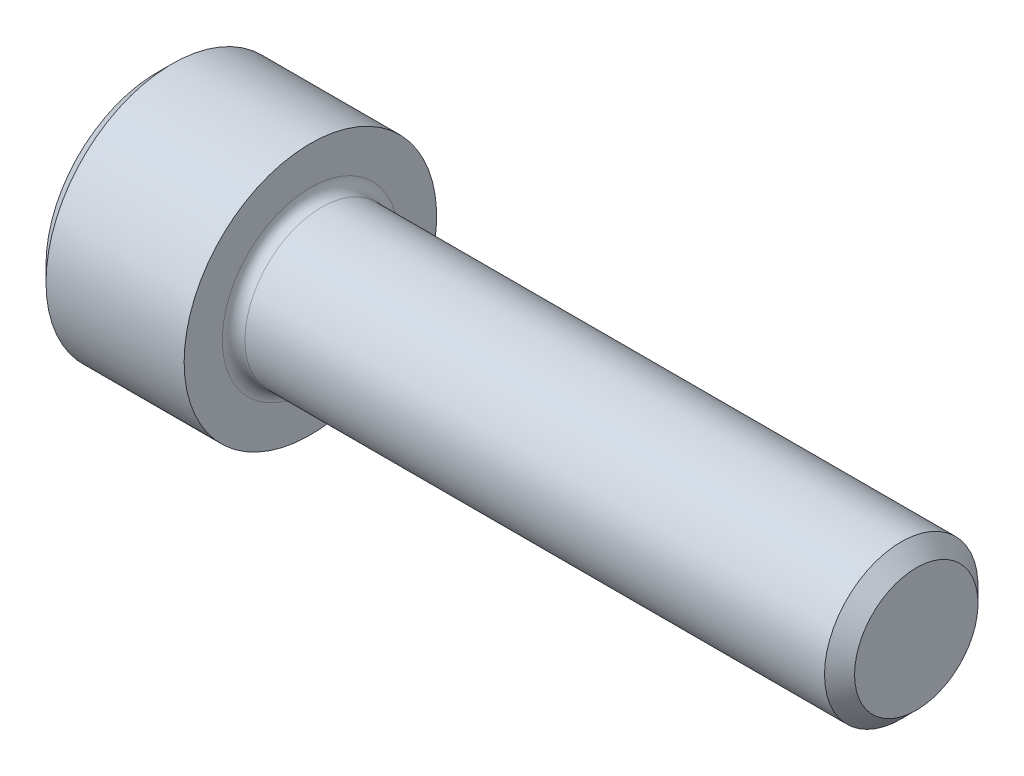
ISO-10303-21;
HEADER;
FILE_DESCRIPTION(('STEP AP214'),'2;1');
FILE_NAME('part.step','',(''),(''),'','','');
FILE_SCHEMA(('AUTOMOTIVE_DESIGN { 1 0 10303 214 1 1 1 1 }'));
ENDSEC;
DATA;
#1=APPLICATION_CONTEXT('core data for automotive mechanical design processes');
#2=APPLICATION_PROTOCOL_DEFINITION('international standard','automotive_design',2000,#1);
#3=PRODUCT_CONTEXT('',#1,'mechanical');
#4=PRODUCT('Part','Part','',(#3));
#5=PRODUCT_RELATED_PRODUCT_CATEGORY('part','',(#4));
#6=PRODUCT_DEFINITION_FORMATION('','',#4);
#7=PRODUCT_DEFINITION_CONTEXT('part definition',#1,'design');
#8=PRODUCT_DEFINITION('design','',#6,#7);
#9=PRODUCT_DEFINITION_SHAPE('','',#8);
#10=(LENGTH_UNIT() NAMED_UNIT(*) SI_UNIT(.MILLI.,.METRE.));
#11=(NAMED_UNIT(*) PLANE_ANGLE_UNIT() SI_UNIT($,.RADIAN.));
#12=(NAMED_UNIT(*) SI_UNIT($,.STERADIAN.) SOLID_ANGLE_UNIT());
#13=UNCERTAINTY_MEASURE_WITH_UNIT(LENGTH_MEASURE(1.E-05),#10,'distance_accuracy_value','');
#14=(GEOMETRIC_REPRESENTATION_CONTEXT(3) GLOBAL_UNCERTAINTY_ASSIGNED_CONTEXT((#13)) GLOBAL_UNIT_ASSIGNED_CONTEXT((#10,
#11,#12)) REPRESENTATION_CONTEXT('',''));
#15=CARTESIAN_POINT('',(0.,0.,0.));
#16=DIRECTION('',(0.,0.,1.));
#17=DIRECTION('',(1.,0.,0.));
#18=AXIS2_PLACEMENT_3D('',#15,#16,#17);
#19=CARTESIAN_POINT('',(0.,0.,0.));
#20=DIRECTION('',(-1.,0.,0.));
#21=DIRECTION('',(0.,0.,1.));
#22=AXIS2_PLACEMENT_3D('',#19,#20,#21);
#23=PLANE('',#22);
#24=DIRECTION('',(0.,-0.499999999999998,0.86602540378444));
#25=VECTOR('',#24,1.);
#26=CARTESIAN_POINT('',(0.,2.2920921156882,0.));
#27=LINE('',#26,#25);
#28=CARTESIAN_POINT('',(0.,2.2920921156882,0.));
#29=VERTEX_POINT('',#28);
#30=CARTESIAN_POINT('',(0.,1.1460460578441,1.98501000000001));
#31=VERTEX_POINT('',#30);
#32=EDGE_CURVE('E357',#29,#31,#27,.T.);
#33=ORIENTED_EDGE('',*,*,#32,.T.);
#34=DIRECTION('',(0.,1.,0.));
#35=VECTOR('',#34,1.);
#36=CARTESIAN_POINT('',(0.,-1.1460460578441,1.98501000000001));
#37=LINE('',#36,#35);
#38=CARTESIAN_POINT('',(0.,-1.1460460578441,1.98501000000001));
#39=VERTEX_POINT('',#38);
#40=EDGE_CURVE('E139',#39,#31,#37,.T.);
#41=ORIENTED_EDGE('',*,*,#40,.F.);
#42=DIRECTION('',(0.,-0.500000000000001,-0.866025403784438));
#43=VECTOR('',#42,1.);
#44=CARTESIAN_POINT('',(0.,-1.1460460578441,1.98501000000001));
#45=LINE('',#44,#43);
#46=CARTESIAN_POINT('',(0.,-2.2920921156882,0.));
#47=VERTEX_POINT('',#46);
#48=EDGE_CURVE('E360',#39,#47,#45,.T.);
#49=ORIENTED_EDGE('',*,*,#48,.T.);
#50=DIRECTION('',(0.,0.499999999999998,-0.86602540378444));
#51=VECTOR('',#50,1.);
#52=CARTESIAN_POINT('',(0.,-2.2920921156882,0.));
#53=LINE('',#52,#51);
#54=CARTESIAN_POINT('',(0.,-1.1460460578441,-1.98501000000001));
#55=VERTEX_POINT('',#54);
#56=EDGE_CURVE('E363',#47,#55,#53,.T.);
#57=ORIENTED_EDGE('',*,*,#56,.T.);
#58=DIRECTION('',(0.,-1.,0.));
#59=VECTOR('',#58,1.);
#60=CARTESIAN_POINT('',(0.,1.1460460578441,-1.98501000000001));
#61=LINE('',#60,#59);
#62=CARTESIAN_POINT('',(0.,1.1460460578441,-1.98501000000001));
#63=VERTEX_POINT('',#62);
#64=EDGE_CURVE('E366',#63,#55,#61,.T.);
#65=ORIENTED_EDGE('',*,*,#64,.F.);
#66=DIRECTION('',(0.,-0.500000000000001,-0.866025403784438));
#67=VECTOR('',#66,1.);
#68=CARTESIAN_POINT('',(0.,2.2920921156882,0.));
#69=LINE('',#68,#67);
#70=EDGE_CURVE('E134',#29,#63,#69,.T.);
#71=ORIENTED_EDGE('',*,*,#70,.F.);
#72=EDGE_LOOP('',(#33,#41,#49,#57,#65,#71));
#73=FACE_BOUND('',#72,.T.);
#74=CARTESIAN_POINT('',(0.,0.,0.));
#75=DIRECTION('',(-1.,0.,0.));
#76=DIRECTION('',(0.,0.,1.));
#77=AXIS2_PLACEMENT_3D('',#74,#75,#76);
#78=CIRCLE('',#77,3.48615);
#79=CARTESIAN_POINT('',(0.,0.,3.48615));
#80=VERTEX_POINT('',#79);
#81=EDGE_CURVE('E150',#80,#80,#78,.T.);
#82=ORIENTED_EDGE('',*,*,#81,.T.);
#83=EDGE_LOOP('',(#82));
#84=FACE_BOUND('',#83,.T.);
#85=ADVANCED_FACE('F47',(#73,#84),#23,.T.);
#86=CARTESIAN_POINT('',(23.876,1.94056000000001,0.));
#87=DIRECTION('',(1.,0.,0.));
#88=DIRECTION('',(0.,0.,-1.));
#89=AXIS2_PLACEMENT_3D('',#86,#87,#88);
#90=PLANE('',#89);
#91=CARTESIAN_POINT('',(23.876,0.,0.));
#92=DIRECTION('',(-1.,0.,0.));
#93=DIRECTION('',(0.,0.,1.));
#94=AXIS2_PLACEMENT_3D('',#91,#92,#93);
#95=CIRCLE('',#94,1.94056);
#96=CARTESIAN_POINT('',(23.876,0.,1.94056));
#97=VERTEX_POINT('',#96);
#98=EDGE_CURVE('E163',#97,#97,#95,.T.);
#99=ORIENTED_EDGE('',*,*,#98,.F.);
#100=EDGE_LOOP('',(#99));
#101=FACE_BOUND('',#100,.T.);
#102=ADVANCED_FACE('F184',(#101),#90,.T.);
#103=CARTESIAN_POINT('',(23.876,0.,0.));
#104=DIRECTION('',(-1.,0.,0.));
#105=DIRECTION('',(0.,0.,1.));
#106=AXIS2_PLACEMENT_3D('',#103,#104,#105);
#107=CONICAL_SURFACE('',#106,1.94056,0.785398163397245);
#108=CARTESIAN_POINT('',(23.4035599999999,0.,0.));
#109=DIRECTION('',(-1.,0.,0.));
#110=DIRECTION('',(0.,0.,1.));
#111=AXIS2_PLACEMENT_3D('',#108,#109,#110);
#112=CIRCLE('',#111,2.4129999999999);
#113=CARTESIAN_POINT('',(23.4035599999999,0.,2.4129999999999));
#114=VERTEX_POINT('',#113);
#115=EDGE_CURVE('E160',#114,#114,#112,.T.);
#116=ORIENTED_EDGE('',*,*,#115,.F.);
#117=EDGE_LOOP('',(#116));
#118=FACE_BOUND('',#117,.T.);
#119=ORIENTED_EDGE('',*,*,#98,.T.);
#120=EDGE_LOOP('',(#119));
#121=FACE_BOUND('',#120,.T.);
#122=ADVANCED_FACE('F190',(#118,#121),#107,.T.);
#123=CARTESIAN_POINT('',(-31.75,0.,0.));
#124=DIRECTION('',(-1.,0.,0.));
#125=DIRECTION('',(0.,0.,1.));
#126=AXIS2_PLACEMENT_3D('',#123,#124,#125);
#127=CYLINDRICAL_SURFACE('',#126,2.41299999999995);
#128=CARTESIAN_POINT('',(5.1816,0.,0.));
#129=DIRECTION('',(1.,0.,0.));
#130=DIRECTION('',(0.,0.,-1.));
#131=AXIS2_PLACEMENT_3D('',#128,#129,#130);
#132=CIRCLE('',#131,2.41299999999995);
#133=CARTESIAN_POINT('',(5.1816,0.,-2.41299999999995));
#134=VERTEX_POINT('',#133);
#135=EDGE_CURVE('E13',#134,#134,#132,.T.);
#136=ORIENTED_EDGE('',*,*,#135,.T.);
#137=EDGE_LOOP('',(#136));
#138=FACE_BOUND('',#137,.T.);
#139=ORIENTED_EDGE('',*,*,#115,.T.);
#140=EDGE_LOOP('',(#139));
#141=FACE_BOUND('',#140,.T.);
#142=ADVANCED_FACE('F201',(#138,#141),#127,.T.);
#143=CARTESIAN_POINT('',(4.826,3.96874999999999,0.));
#144=DIRECTION('',(1.,0.,0.));
#145=DIRECTION('',(0.,0.,-1.));
#146=AXIS2_PLACEMENT_3D('',#143,#144,#145);
#147=PLANE('',#146);
#148=CARTESIAN_POINT('',(4.826,0.,0.));
#149=DIRECTION('',(1.,0.,0.));
#150=DIRECTION('',(0.,0.,-1.));
#151=AXIS2_PLACEMENT_3D('',#148,#149,#150);
#152=CIRCLE('',#151,2.76859999999995);
#153=CARTESIAN_POINT('',(4.826,0.,-2.76859999999995));
#154=VERTEX_POINT('',#153);
#155=EDGE_CURVE('E55',#154,#154,#152,.F.);
#156=ORIENTED_EDGE('',*,*,#155,.T.);
#157=EDGE_LOOP('',(#156));
#158=FACE_BOUND('',#157,.T.);
#159=CARTESIAN_POINT('',(4.826,0.,0.));
#160=DIRECTION('',(-1.,0.,0.));
#161=DIRECTION('',(0.,0.,1.));
#162=AXIS2_PLACEMENT_3D('',#159,#160,#161);
#163=CIRCLE('',#162,3.96875);
#164=CARTESIAN_POINT('',(4.826,0.,3.96875));
#165=VERTEX_POINT('',#164);
#166=EDGE_CURVE('E157',#165,#165,#163,.T.);
#167=ORIENTED_EDGE('',*,*,#166,.F.);
#168=EDGE_LOOP('',(#167));
#169=FACE_BOUND('',#168,.T.);
#170=ADVANCED_FACE('F168',(#158,#169),#147,.T.);
#171=CARTESIAN_POINT('',(-31.75,0.,0.));
#172=DIRECTION('',(-1.,0.,0.));
#173=DIRECTION('',(0.,0.,1.));
#174=AXIS2_PLACEMENT_3D('',#171,#172,#173);
#175=CYLINDRICAL_SURFACE('',#174,3.96875);
#176=ORIENTED_EDGE('',*,*,#166,.T.);
#177=EDGE_LOOP('',(#176));
#178=FACE_BOUND('',#177,.T.);
#179=CARTESIAN_POINT('',(0.4826,0.,0.));
#180=DIRECTION('',(-1.,0.,0.));
#181=DIRECTION('',(0.,0.,1.));
#182=AXIS2_PLACEMENT_3D('',#179,#180,#181);
#183=CIRCLE('',#182,3.96875);
#184=CARTESIAN_POINT('',(0.4826,0.,3.96875));
#185=VERTEX_POINT('',#184);
#186=EDGE_CURVE('E154',#185,#185,#183,.T.);
#187=ORIENTED_EDGE('',*,*,#186,.F.);
#188=EDGE_LOOP('',(#187));
#189=FACE_BOUND('',#188,.T.);
#190=ADVANCED_FACE('F179',(#178,#189),#175,.T.);
#191=CARTESIAN_POINT('',(0.,0.,0.));
#192=DIRECTION('',(1.,0.,0.));
#193=DIRECTION('',(0.,0.,-1.));
#194=AXIS2_PLACEMENT_3D('',#191,#192,#193);
#195=CONICAL_SURFACE('',#194,3.48615,0.785398163397449);
#196=ORIENTED_EDGE('',*,*,#186,.T.);
#197=EDGE_LOOP('',(#196));
#198=FACE_BOUND('',#197,.T.);
#199=ORIENTED_EDGE('',*,*,#81,.F.);
#200=EDGE_LOOP('',(#199));
#201=FACE_BOUND('',#200,.T.);
#202=ADVANCED_FACE('F172',(#198,#201),#195,.T.);
#203=CARTESIAN_POINT('',(5.1816,0.,0.));
#204=DIRECTION('',(1.,0.,0.));
#205=DIRECTION('',(0.,0.,-1.));
#206=AXIS2_PLACEMENT_3D('',#203,#204,#205);
#207=TOROIDAL_SURFACE('',#206,2.76859999999995,0.3556);
#208=ORIENTED_EDGE('',*,*,#135,.F.);
#209=EDGE_LOOP('',(#208));
#210=FACE_BOUND('',#209,.T.);
#211=ORIENTED_EDGE('',*,*,#155,.F.);
#212=EDGE_LOOP('',(#211));
#213=FACE_BOUND('',#212,.T.);
#214=ADVANCED_FACE('F49',(#210,#213),#207,.F.);
#215=CARTESIAN_POINT('',(2.286,2.2920921156882,0.));
#216=DIRECTION('',(0.,-0.86602540378444,-0.499999999999998));
#217=DIRECTION('',(0.,0.499999999999998,-0.86602540378444));
#218=AXIS2_PLACEMENT_3D('',#215,#216,#217);
#219=PLANE('',#218);
#220=ORIENTED_EDGE('',*,*,#32,.F.);
#221=DIRECTION('',(-1.,0.,0.));
#222=VECTOR('',#221,1.);
#223=CARTESIAN_POINT('',(2.286,2.2920921156882,0.));
#224=LINE('',#223,#222);
#225=CARTESIAN_POINT('',(2.286,2.2920921156882,0.));
#226=VERTEX_POINT('',#225);
#227=EDGE_CURVE('E356',#226,#29,#224,.T.);
#228=ORIENTED_EDGE('',*,*,#227,.F.);
#229=DIRECTION('',(0.,-0.499999999999998,0.86602540378444));
#230=VECTOR('',#229,1.);
#231=CARTESIAN_POINT('',(2.286,2.2920921156882,0.));
#232=LINE('',#231,#230);
#233=CARTESIAN_POINT('',(2.28600000000001,1.71906908676614,0.992505000000005));
#234=VERTEX_POINT('',#233);
#235=EDGE_CURVE('E62',#226,#234,#232,.T.);
#236=ORIENTED_EDGE('',*,*,#235,.T.);
#237=CARTESIAN_POINT('',(2.286,1.1460460578441,1.98501000000001));
#238=VERTEX_POINT('',#237);
#239=EDGE_CURVE('E120',#234,#238,#232,.T.);
#240=ORIENTED_EDGE('',*,*,#239,.T.);
#241=DIRECTION('',(-1.,0.,0.));
#242=VECTOR('',#241,1.);
#243=CARTESIAN_POINT('',(2.286,1.1460460578441,1.98501000000001));
#244=LINE('',#243,#242);
#245=EDGE_CURVE('E132',#238,#31,#244,.T.);
#246=ORIENTED_EDGE('',*,*,#245,.T.);
#247=EDGE_LOOP('',(#220,#228,#236,#240,#246));
#248=FACE_BOUND('',#247,.T.);
#249=ADVANCED_FACE('F131',(#248),#219,.T.);
#250=CARTESIAN_POINT('',(2.286,-1.1460460578441,1.98501000000001));
#251=DIRECTION('',(0.,0.,1.));
#252=DIRECTION('',(0.,-1.,0.));
#253=AXIS2_PLACEMENT_3D('',#250,#251,#252);
#254=PLANE('',#253);
#255=ORIENTED_EDGE('',*,*,#40,.T.);
#256=ORIENTED_EDGE('',*,*,#245,.F.);
#257=DIRECTION('',(0.,1.,0.));
#258=VECTOR('',#257,1.);
#259=CARTESIAN_POINT('',(2.286,-1.1460460578441,1.98501000000001));
#260=LINE('',#259,#258);
#261=CARTESIAN_POINT('',(2.286,0.,1.98501000000001));
#262=VERTEX_POINT('',#261);
#263=EDGE_CURVE('E118',#262,#238,#260,.T.);
#264=ORIENTED_EDGE('',*,*,#263,.F.);
#265=CARTESIAN_POINT('',(2.286,-1.1460460578441,1.98501000000001));
#266=VERTEX_POINT('',#265);
#267=EDGE_CURVE('E128',#266,#262,#260,.T.);
#268=ORIENTED_EDGE('',*,*,#267,.F.);
#269=DIRECTION('',(-1.,0.,0.));
#270=VECTOR('',#269,1.);
#271=CARTESIAN_POINT('',(2.286,-1.1460460578441,1.98501000000001));
#272=LINE('',#271,#270);
#273=EDGE_CURVE('E141',#266,#39,#272,.T.);
#274=ORIENTED_EDGE('',*,*,#273,.T.);
#275=EDGE_LOOP('',(#255,#256,#264,#268,#274));
#276=FACE_BOUND('',#275,.T.);
#277=ADVANCED_FACE('F136',(#276),#254,.F.);
#278=CARTESIAN_POINT('',(2.286,-1.1460460578441,1.98501000000001));
#279=DIRECTION('',(0.,0.866025403784438,-0.500000000000001));
#280=DIRECTION('',(0.,0.500000000000001,0.866025403784438));
#281=AXIS2_PLACEMENT_3D('',#278,#279,#280);
#282=PLANE('',#281);
#283=ORIENTED_EDGE('',*,*,#48,.F.);
#284=ORIENTED_EDGE('',*,*,#273,.F.);
#285=DIRECTION('',(0.,-0.500000000000001,-0.866025403784438));
#286=VECTOR('',#285,1.);
#287=CARTESIAN_POINT('',(2.286,-1.1460460578441,1.98501000000001));
#288=LINE('',#287,#286);
#289=CARTESIAN_POINT('',(2.286,-1.71906908676614,0.992505000000005));
#290=VERTEX_POINT('',#289);
#291=EDGE_CURVE('E337',#266,#290,#288,.T.);
#292=ORIENTED_EDGE('',*,*,#291,.T.);
#293=CARTESIAN_POINT('',(2.286,-2.2920921156882,0.));
#294=VERTEX_POINT('',#293);
#295=EDGE_CURVE('E339',#290,#294,#288,.T.);
#296=ORIENTED_EDGE('',*,*,#295,.T.);
#297=DIRECTION('',(-1.,0.,0.));
#298=VECTOR('',#297,1.);
#299=CARTESIAN_POINT('',(2.286,-2.2920921156882,0.));
#300=LINE('',#299,#298);
#301=EDGE_CURVE('E146',#294,#47,#300,.T.);
#302=ORIENTED_EDGE('',*,*,#301,.T.);
#303=EDGE_LOOP('',(#283,#284,#292,#296,#302));
#304=FACE_BOUND('',#303,.T.);
#305=ADVANCED_FACE('F252',(#304),#282,.T.);
#306=CARTESIAN_POINT('',(2.286,-2.2920921156882,0.));
#307=DIRECTION('',(0.,0.86602540378444,0.499999999999998));
#308=DIRECTION('',(0.,-0.499999999999998,0.86602540378444));
#309=AXIS2_PLACEMENT_3D('',#306,#307,#308);
#310=PLANE('',#309);
#311=ORIENTED_EDGE('',*,*,#56,.F.);
#312=ORIENTED_EDGE('',*,*,#301,.F.);
#313=DIRECTION('',(0.,0.499999999999998,-0.86602540378444));
#314=VECTOR('',#313,1.);
#315=CARTESIAN_POINT('',(2.286,-2.2920921156882,0.));
#316=LINE('',#315,#314);
#317=CARTESIAN_POINT('',(2.286,-1.71906908676614,-0.992505000000005));
#318=VERTEX_POINT('',#317);
#319=EDGE_CURVE('E342',#294,#318,#316,.T.);
#320=ORIENTED_EDGE('',*,*,#319,.T.);
#321=CARTESIAN_POINT('',(2.286,-1.1460460578441,-1.98501000000001));
#322=VERTEX_POINT('',#321);
#323=EDGE_CURVE('E346',#318,#322,#316,.T.);
#324=ORIENTED_EDGE('',*,*,#323,.T.);
#325=DIRECTION('',(-1.,0.,0.));
#326=VECTOR('',#325,1.);
#327=CARTESIAN_POINT('',(2.286,-1.1460460578441,-1.98501000000001));
#328=LINE('',#327,#326);
#329=EDGE_CURVE('E375',#322,#55,#328,.T.);
#330=ORIENTED_EDGE('',*,*,#329,.T.);
#331=EDGE_LOOP('',(#311,#312,#320,#324,#330));
#332=FACE_BOUND('',#331,.T.);
#333=ADVANCED_FACE('F259',(#332),#310,.T.);
#334=CARTESIAN_POINT('',(2.286,1.1460460578441,-1.98501000000001));
#335=DIRECTION('',(0.,0.,-1.));
#336=DIRECTION('',(0.,1.,0.));
#337=AXIS2_PLACEMENT_3D('',#334,#335,#336);
#338=PLANE('',#337);
#339=ORIENTED_EDGE('',*,*,#64,.T.);
#340=ORIENTED_EDGE('',*,*,#329,.F.);
#341=DIRECTION('',(0.,-1.,0.));
#342=VECTOR('',#341,1.);
#343=CARTESIAN_POINT('',(2.286,1.1460460578441,-1.98501000000001));
#344=LINE('',#343,#342);
#345=CARTESIAN_POINT('',(2.286,0.,-1.98501000000001));
#346=VERTEX_POINT('',#345);
#347=EDGE_CURVE('E350',#346,#322,#344,.T.);
#348=ORIENTED_EDGE('',*,*,#347,.F.);
#349=CARTESIAN_POINT('',(2.286,1.1460460578441,-1.98501000000001));
#350=VERTEX_POINT('',#349);
#351=EDGE_CURVE('E351',#350,#346,#344,.T.);
#352=ORIENTED_EDGE('',*,*,#351,.F.);
#353=DIRECTION('',(-1.,0.,0.));
#354=VECTOR('',#353,1.);
#355=CARTESIAN_POINT('',(2.286,1.1460460578441,-1.98501000000001));
#356=LINE('',#355,#354);
#357=EDGE_CURVE('E372',#350,#63,#356,.T.);
#358=ORIENTED_EDGE('',*,*,#357,.T.);
#359=EDGE_LOOP('',(#339,#340,#348,#352,#358));
#360=FACE_BOUND('',#359,.T.);
#361=ADVANCED_FACE('F267',(#360),#338,.F.);
#362=CARTESIAN_POINT('',(2.286,2.2920921156882,0.));
#363=DIRECTION('',(0.,0.866025403784438,-0.500000000000001));
#364=DIRECTION('',(0.,0.500000000000001,0.866025403784438));
#365=AXIS2_PLACEMENT_3D('',#362,#363,#364);
#366=PLANE('',#365);
#367=ORIENTED_EDGE('',*,*,#70,.T.);
#368=ORIENTED_EDGE('',*,*,#357,.F.);
#369=DIRECTION('',(0.,-0.500000000000001,-0.866025403784438));
#370=VECTOR('',#369,1.);
#371=CARTESIAN_POINT('',(2.286,2.2920921156882,0.));
#372=LINE('',#371,#370);
#373=CARTESIAN_POINT('',(2.286,1.71906908676614,-0.992505000000005));
#374=VERTEX_POINT('',#373);
#375=EDGE_CURVE('E354',#374,#350,#372,.T.);
#376=ORIENTED_EDGE('',*,*,#375,.F.);
#377=EDGE_CURVE('E328',#226,#374,#372,.T.);
#378=ORIENTED_EDGE('',*,*,#377,.F.);
#379=ORIENTED_EDGE('',*,*,#227,.T.);
#380=EDGE_LOOP('',(#367,#368,#376,#378,#379));
#381=FACE_BOUND('',#380,.T.);
#382=ADVANCED_FACE('F275',(#381),#366,.F.);
#383=CARTESIAN_POINT('',(2.286,1.1460460578441,1.98501000000001));
#384=DIRECTION('',(-1.,0.,0.));
#385=DIRECTION('',(0.,0.,1.));
#386=AXIS2_PLACEMENT_3D('',#383,#384,#385);
#387=PLANE('',#386);
#388=CARTESIAN_POINT('',(2.28600000000001,0.,0.));
#389=DIRECTION('',(-1.,0.,0.));
#390=DIRECTION('',(0.,0.,1.));
#391=AXIS2_PLACEMENT_3D('',#388,#389,#390);
#392=CIRCLE('',#391,1.98501);
#393=EDGE_CURVE('E140',#290,#262,#392,.T.);
#394=ORIENTED_EDGE('',*,*,#393,.F.);
#395=ORIENTED_EDGE('',*,*,#291,.F.);
#396=ORIENTED_EDGE('',*,*,#267,.T.);
#397=EDGE_LOOP('',(#394,#395,#396));
#398=FACE_BOUND('',#397,.T.);
#399=ADVANCED_FACE('F283',(#398),#387,.T.);
#400=EDGE_CURVE('E144',#318,#290,#392,.T.);
#401=ORIENTED_EDGE('',*,*,#400,.F.);
#402=ORIENTED_EDGE('',*,*,#319,.F.);
#403=ORIENTED_EDGE('',*,*,#295,.F.);
#404=EDGE_LOOP('',(#401,#402,#403));
#405=FACE_BOUND('',#404,.T.);
#406=ADVANCED_FACE('F291',(#405),#387,.T.);
#407=EDGE_CURVE('E381',#346,#318,#392,.T.);
#408=ORIENTED_EDGE('',*,*,#407,.F.);
#409=ORIENTED_EDGE('',*,*,#347,.T.);
#410=ORIENTED_EDGE('',*,*,#323,.F.);
#411=EDGE_LOOP('',(#408,#409,#410));
#412=FACE_BOUND('',#411,.T.);
#413=ADVANCED_FACE('F299',(#412),#387,.T.);
#414=EDGE_CURVE('E331',#374,#346,#392,.T.);
#415=ORIENTED_EDGE('',*,*,#414,.F.);
#416=ORIENTED_EDGE('',*,*,#375,.T.);
#417=ORIENTED_EDGE('',*,*,#351,.T.);
#418=EDGE_LOOP('',(#415,#416,#417));
#419=FACE_BOUND('',#418,.T.);
#420=ADVANCED_FACE('F306',(#419),#387,.T.);
#421=EDGE_CURVE('E151',#234,#374,#392,.T.);
#422=ORIENTED_EDGE('',*,*,#421,.F.);
#423=ORIENTED_EDGE('',*,*,#235,.F.);
#424=ORIENTED_EDGE('',*,*,#377,.T.);
#425=EDGE_LOOP('',(#422,#423,#424));
#426=FACE_BOUND('',#425,.T.);
#427=ADVANCED_FACE('F313',(#426),#387,.T.);
#428=EDGE_CURVE('E123',#262,#234,#392,.T.);
#429=ORIENTED_EDGE('',*,*,#428,.F.);
#430=ORIENTED_EDGE('',*,*,#263,.T.);
#431=ORIENTED_EDGE('',*,*,#239,.F.);
#432=EDGE_LOOP('',(#429,#430,#431));
#433=FACE_BOUND('',#432,.T.);
#434=ADVANCED_FACE('F119',(#433),#387,.T.);
#435=CARTESIAN_POINT('',(2.28600000000001,0.,0.));
#436=DIRECTION('',(-1.,0.,0.));
#437=DIRECTION('',(0.,0.,1.));
#438=AXIS2_PLACEMENT_3D('',#435,#436,#437);
#439=CONICAL_SURFACE('',#438,1.98501,1.04719755119659);
#440=CARTESIAN_POINT('',(3.43204605784411,0.,0.));
#441=VERTEX_POINT('',#440);
#442=VERTEX_LOOP('',#441);
#443=FACE_BOUND('',#442,.T.);
#444=ORIENTED_EDGE('',*,*,#428,.T.);
#445=ORIENTED_EDGE('',*,*,#421,.T.);
#446=ORIENTED_EDGE('',*,*,#414,.T.);
#447=ORIENTED_EDGE('',*,*,#407,.T.);
#448=ORIENTED_EDGE('',*,*,#400,.T.);
#449=ORIENTED_EDGE('',*,*,#393,.T.);
#450=EDGE_LOOP('',(#444,#445,#446,#447,#448,#449));
#451=FACE_BOUND('',#450,.T.);
#452=ADVANCED_FACE('F194',(#443,#451),#439,.F.);
#453=CLOSED_SHELL('',(#85,#102,#122,#142,#170,#190,#202,#214,#249,#277,#305,#333,#361,#382,#399,
#406,#413,#420,#427,#434,#452));
#454=MANIFOLD_SOLID_BREP('B2',#453);
#455=ADVANCED_BREP_SHAPE_REPRESENTATION('',(#18,#454),#14);
#456=SHAPE_DEFINITION_REPRESENTATION(#9,#455);
ENDSEC;
END-ISO-10303-21;
